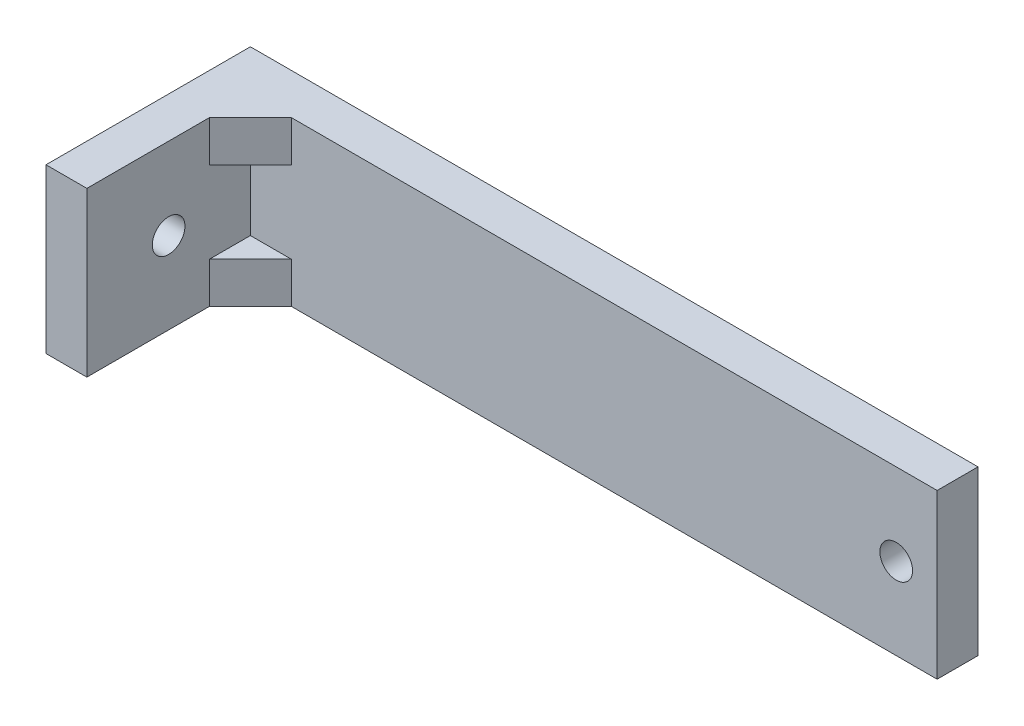
ISO-10303-21;
HEADER;
FILE_DESCRIPTION(('STEP AP214'),'2;1');
FILE_NAME('part.step','',(''),(''),'','','');
FILE_SCHEMA(('AUTOMOTIVE_DESIGN { 1 0 10303 214 1 1 1 1 }'));
ENDSEC;
DATA;
#1=APPLICATION_CONTEXT('core data for automotive mechanical design processes');
#2=APPLICATION_PROTOCOL_DEFINITION('international standard','automotive_design',2000,#1);
#3=PRODUCT_CONTEXT('',#1,'mechanical');
#4=PRODUCT('Part','Part','',(#3));
#5=PRODUCT_RELATED_PRODUCT_CATEGORY('part','',(#4));
#6=PRODUCT_DEFINITION_FORMATION('','',#4);
#7=PRODUCT_DEFINITION_CONTEXT('part definition',#1,'design');
#8=PRODUCT_DEFINITION('design','',#6,#7);
#9=PRODUCT_DEFINITION_SHAPE('','',#8);
#10=(LENGTH_UNIT() NAMED_UNIT(*) SI_UNIT(.MILLI.,.METRE.));
#11=(NAMED_UNIT(*) PLANE_ANGLE_UNIT() SI_UNIT($,.RADIAN.));
#12=(NAMED_UNIT(*) SI_UNIT($,.STERADIAN.) SOLID_ANGLE_UNIT());
#13=UNCERTAINTY_MEASURE_WITH_UNIT(LENGTH_MEASURE(1.E-05),#10,'distance_accuracy_value','');
#14=(GEOMETRIC_REPRESENTATION_CONTEXT(3) GLOBAL_UNCERTAINTY_ASSIGNED_CONTEXT((#13)) GLOBAL_UNIT_ASSIGNED_CONTEXT((#10,
#11,#12)) REPRESENTATION_CONTEXT('',''));
#15=CARTESIAN_POINT('',(0.,0.,0.));
#16=DIRECTION('',(0.,0.,1.));
#17=DIRECTION('',(1.,0.,0.));
#18=AXIS2_PLACEMENT_3D('',#15,#16,#17);
#19=CARTESIAN_POINT('',(0.,0.,5.));
#20=DIRECTION('',(0.,0.,1.));
#21=DIRECTION('',(1.,0.,0.));
#22=AXIS2_PLACEMENT_3D('',#19,#20,#21);
#23=PLANE('',#22);
#24=DIRECTION('',(-1.,0.,0.));
#25=VECTOR('',#24,1.);
#26=CARTESIAN_POINT('',(-34.5,-5.,5.));
#27=LINE('',#26,#25);
#28=CARTESIAN_POINT('',(-34.5,-5.,5.));
#29=VERTEX_POINT('',#28);
#30=CARTESIAN_POINT('',(-39.5,-5.,5.));
#31=VERTEX_POINT('',#30);
#32=EDGE_CURVE('E184',#29,#31,#27,.T.);
#33=ORIENTED_EDGE('',*,*,#32,.F.);
#34=DIRECTION('',(0.,1.,0.));
#35=VECTOR('',#34,1.);
#36=CARTESIAN_POINT('',(-34.5,-10.,5.));
#37=LINE('',#36,#35);
#38=CARTESIAN_POINT('',(-34.5,-10.,5.));
#39=VERTEX_POINT('',#38);
#40=EDGE_CURVE('E115',#39,#29,#37,.T.);
#41=ORIENTED_EDGE('',*,*,#40,.F.);
#42=DIRECTION('',(1.,0.,0.));
#43=VECTOR('',#42,1.);
#44=CARTESIAN_POINT('',(-44.5,-10.,5.));
#45=LINE('',#44,#43);
#46=CARTESIAN_POINT('',(44.5,-10.,5.));
#47=VERTEX_POINT('',#46);
#48=EDGE_CURVE('E125',#39,#47,#45,.T.);
#49=ORIENTED_EDGE('',*,*,#48,.T.);
#50=DIRECTION('',(0.,1.,0.));
#51=VECTOR('',#50,1.);
#52=CARTESIAN_POINT('',(44.5,10.,5.));
#53=LINE('',#52,#51);
#54=CARTESIAN_POINT('',(44.5,10.,5.));
#55=VERTEX_POINT('',#54);
#56=EDGE_CURVE('E145',#47,#55,#53,.T.);
#57=ORIENTED_EDGE('',*,*,#56,.T.);
#58=DIRECTION('',(-1.,0.,0.));
#59=VECTOR('',#58,1.);
#60=CARTESIAN_POINT('',(-44.5,10.,5.));
#61=LINE('',#60,#59);
#62=CARTESIAN_POINT('',(-34.5,10.,5.));
#63=VERTEX_POINT('',#62);
#64=EDGE_CURVE('E148',#55,#63,#61,.T.);
#65=ORIENTED_EDGE('',*,*,#64,.T.);
#66=DIRECTION('',(0.,1.,0.));
#67=VECTOR('',#66,1.);
#68=CARTESIAN_POINT('',(-34.5,10.,5.));
#69=LINE('',#68,#67);
#70=CARTESIAN_POINT('',(-34.5,5.,5.));
#71=VERTEX_POINT('',#70);
#72=EDGE_CURVE('E222',#71,#63,#69,.T.);
#73=ORIENTED_EDGE('',*,*,#72,.F.);
#74=DIRECTION('',(-1.,0.,0.));
#75=VECTOR('',#74,1.);
#76=CARTESIAN_POINT('',(-34.5,5.,5.));
#77=LINE('',#76,#75);
#78=CARTESIAN_POINT('',(-39.5,5.,5.));
#79=VERTEX_POINT('',#78);
#80=EDGE_CURVE('E190',#71,#79,#77,.T.);
#81=ORIENTED_EDGE('',*,*,#80,.T.);
#82=DIRECTION('',(0.,1.,0.));
#83=VECTOR('',#82,1.);
#84=CARTESIAN_POINT('',(-39.5,10.,5.));
#85=LINE('',#84,#83);
#86=EDGE_CURVE('E202',#31,#79,#85,.T.);
#87=ORIENTED_EDGE('',*,*,#86,.F.);
#88=EDGE_LOOP('',(#33,#41,#49,#57,#65,#73,#81,#87));
#89=FACE_BOUND('',#88,.T.);
#90=CARTESIAN_POINT('',(39.5,0.,5.));
#91=DIRECTION('',(0.,0.,1.));
#92=DIRECTION('',(1.,0.,0.));
#93=AXIS2_PLACEMENT_3D('',#90,#91,#92);
#94=CIRCLE('',#93,2.);
#95=CARTESIAN_POINT('',(41.5,0.,5.));
#96=VERTEX_POINT('',#95);
#97=EDGE_CURVE('E195',#96,#96,#94,.T.);
#98=ORIENTED_EDGE('',*,*,#97,.F.);
#99=EDGE_LOOP('',(#98));
#100=FACE_BOUND('',#99,.T.);
#101=ADVANCED_FACE('F34',(#89,#100),#23,.T.);
#102=CARTESIAN_POINT('',(-39.5,10.,25.));
#103=DIRECTION('',(-1.,0.,0.));
#104=DIRECTION('',(0.,0.,1.));
#105=AXIS2_PLACEMENT_3D('',#102,#103,#104);
#106=PLANE('',#105);
#107=DIRECTION('',(0.,0.,-1.));
#108=VECTOR('',#107,1.);
#109=CARTESIAN_POINT('',(-39.5,5.,5.));
#110=LINE('',#109,#108);
#111=CARTESIAN_POINT('',(-39.5,5.,10.));
#112=VERTEX_POINT('',#111);
#113=EDGE_CURVE('E210',#112,#79,#110,.T.);
#114=ORIENTED_EDGE('',*,*,#113,.F.);
#115=DIRECTION('',(0.,-1.,0.));
#116=VECTOR('',#115,1.);
#117=CARTESIAN_POINT('',(-39.5,10.,10.));
#118=LINE('',#117,#116);
#119=CARTESIAN_POINT('',(-39.5,10.,10.));
#120=VERTEX_POINT('',#119);
#121=EDGE_CURVE('E215',#120,#112,#118,.T.);
#122=ORIENTED_EDGE('',*,*,#121,.F.);
#123=DIRECTION('',(0.,0.,-1.));
#124=VECTOR('',#123,1.);
#125=CARTESIAN_POINT('',(-39.5,10.,25.));
#126=LINE('',#125,#124);
#127=CARTESIAN_POINT('',(-39.5,10.,25.));
#128=VERTEX_POINT('',#127);
#129=EDGE_CURVE('E135',#128,#120,#126,.T.);
#130=ORIENTED_EDGE('',*,*,#129,.F.);
#131=DIRECTION('',(0.,1.,0.));
#132=VECTOR('',#131,1.);
#133=CARTESIAN_POINT('',(-39.5,10.,25.));
#134=LINE('',#133,#132);
#135=CARTESIAN_POINT('',(-39.5,-10.,25.));
#136=VERTEX_POINT('',#135);
#137=EDGE_CURVE('E133',#136,#128,#134,.T.);
#138=ORIENTED_EDGE('',*,*,#137,.F.);
#139=DIRECTION('',(0.,0.,-1.));
#140=VECTOR('',#139,1.);
#141=CARTESIAN_POINT('',(-39.5,-10.,25.));
#142=LINE('',#141,#140);
#143=CARTESIAN_POINT('',(-39.5,-10.,10.));
#144=VERTEX_POINT('',#143);
#145=EDGE_CURVE('E122',#136,#144,#142,.T.);
#146=ORIENTED_EDGE('',*,*,#145,.T.);
#147=DIRECTION('',(0.,-1.,0.));
#148=VECTOR('',#147,1.);
#149=CARTESIAN_POINT('',(-39.5,-10.,10.));
#150=LINE('',#149,#148);
#151=CARTESIAN_POINT('',(-39.5,-5.,10.));
#152=VERTEX_POINT('',#151);
#153=EDGE_CURVE('E110',#152,#144,#150,.T.);
#154=ORIENTED_EDGE('',*,*,#153,.F.);
#155=DIRECTION('',(0.,0.,1.));
#156=VECTOR('',#155,1.);
#157=CARTESIAN_POINT('',(-39.5,-5.,5.));
#158=LINE('',#157,#156);
#159=EDGE_CURVE('E57',#31,#152,#158,.T.);
#160=ORIENTED_EDGE('',*,*,#159,.F.);
#161=ORIENTED_EDGE('',*,*,#86,.T.);
#162=EDGE_LOOP('',(#114,#122,#130,#138,#146,#154,#160,#161));
#163=FACE_BOUND('',#162,.T.);
#164=CARTESIAN_POINT('',(-39.5,0.,15.));
#165=DIRECTION('',(1.,0.,0.));
#166=DIRECTION('',(0.,0.,-1.));
#167=AXIS2_PLACEMENT_3D('',#164,#165,#166);
#168=CIRCLE('',#167,2.);
#169=CARTESIAN_POINT('',(-39.5,0.,13.));
#170=VERTEX_POINT('',#169);
#171=EDGE_CURVE('E198',#170,#170,#168,.T.);
#172=ORIENTED_EDGE('',*,*,#171,.F.);
#173=EDGE_LOOP('',(#172));
#174=FACE_BOUND('',#173,.T.);
#175=ADVANCED_FACE('F130',(#163,#174),#106,.F.);
#176=CARTESIAN_POINT('',(44.5,10.,5.));
#177=DIRECTION('',(-1.,0.,0.));
#178=DIRECTION('',(0.,0.,1.));
#179=AXIS2_PLACEMENT_3D('',#176,#177,#178);
#180=PLANE('',#179);
#181=DIRECTION('',(0.,1.,0.));
#182=VECTOR('',#181,1.);
#183=CARTESIAN_POINT('',(44.5,10.,0.));
#184=LINE('',#183,#182);
#185=CARTESIAN_POINT('',(44.5,-10.,0.));
#186=VERTEX_POINT('',#185);
#187=CARTESIAN_POINT('',(44.5,10.,0.));
#188=VERTEX_POINT('',#187);
#189=EDGE_CURVE('E134',#186,#188,#184,.T.);
#190=ORIENTED_EDGE('',*,*,#189,.T.);
#191=DIRECTION('',(0.,0.,-1.));
#192=VECTOR('',#191,1.);
#193=CARTESIAN_POINT('',(44.5,10.,5.));
#194=LINE('',#193,#192);
#195=EDGE_CURVE('E11',#55,#188,#194,.T.);
#196=ORIENTED_EDGE('',*,*,#195,.F.);
#197=ORIENTED_EDGE('',*,*,#56,.F.);
#198=DIRECTION('',(0.,0.,-1.));
#199=VECTOR('',#198,1.);
#200=CARTESIAN_POINT('',(44.5,-10.,5.));
#201=LINE('',#200,#199);
#202=EDGE_CURVE('E152',#47,#186,#201,.T.);
#203=ORIENTED_EDGE('',*,*,#202,.T.);
#204=EDGE_LOOP('',(#190,#196,#197,#203));
#205=FACE_BOUND('',#204,.T.);
#206=ADVANCED_FACE('F36',(#205),#180,.F.);
#207=CARTESIAN_POINT('',(-44.5,10.,5.));
#208=DIRECTION('',(0.,-1.,0.));
#209=DIRECTION('',(0.,0.,-1.));
#210=AXIS2_PLACEMENT_3D('',#207,#208,#209);
#211=PLANE('',#210);
#212=ORIENTED_EDGE('',*,*,#129,.T.);
#213=DIRECTION('',(-0.707106781186547,0.,0.707106781186548));
#214=VECTOR('',#213,1.);
#215=CARTESIAN_POINT('',(-34.5,10.,5.));
#216=LINE('',#215,#214);
#217=EDGE_CURVE('E127',#63,#120,#216,.T.);
#218=ORIENTED_EDGE('',*,*,#217,.F.);
#219=ORIENTED_EDGE('',*,*,#64,.F.);
#220=ORIENTED_EDGE('',*,*,#195,.T.);
#221=DIRECTION('',(-1.,0.,0.));
#222=VECTOR('',#221,1.);
#223=CARTESIAN_POINT('',(-44.5,10.,0.));
#224=LINE('',#223,#222);
#225=CARTESIAN_POINT('',(-44.5,10.,0.));
#226=VERTEX_POINT('',#225);
#227=EDGE_CURVE('E138',#188,#226,#224,.T.);
#228=ORIENTED_EDGE('',*,*,#227,.T.);
#229=DIRECTION('',(0.,0.,-1.));
#230=VECTOR('',#229,1.);
#231=CARTESIAN_POINT('',(-44.5,10.,5.));
#232=LINE('',#231,#230);
#233=CARTESIAN_POINT('',(-44.5,10.,25.));
#234=VERTEX_POINT('',#233);
#235=EDGE_CURVE('E42',#234,#226,#232,.T.);
#236=ORIENTED_EDGE('',*,*,#235,.F.);
#237=DIRECTION('',(-1.,0.,0.));
#238=VECTOR('',#237,1.);
#239=CARTESIAN_POINT('',(-44.5,10.,25.));
#240=LINE('',#239,#238);
#241=EDGE_CURVE('E141',#128,#234,#240,.T.);
#242=ORIENTED_EDGE('',*,*,#241,.F.);
#243=EDGE_LOOP('',(#212,#218,#219,#220,#228,#236,#242));
#244=FACE_BOUND('',#243,.T.);
#245=ADVANCED_FACE('F228',(#244),#211,.F.);
#246=CARTESIAN_POINT('',(-44.5,10.,5.));
#247=DIRECTION('',(1.,0.,0.));
#248=DIRECTION('',(0.,0.,-1.));
#249=AXIS2_PLACEMENT_3D('',#246,#247,#248);
#250=PLANE('',#249);
#251=CARTESIAN_POINT('',(-44.5,0.,15.));
#252=DIRECTION('',(1.,0.,0.));
#253=DIRECTION('',(0.,0.,-1.));
#254=AXIS2_PLACEMENT_3D('',#251,#252,#253);
#255=CIRCLE('',#254,2.);
#256=CARTESIAN_POINT('',(-44.5,0.,13.));
#257=VERTEX_POINT('',#256);
#258=EDGE_CURVE('E199',#257,#257,#255,.T.);
#259=ORIENTED_EDGE('',*,*,#258,.T.);
#260=EDGE_LOOP('',(#259));
#261=FACE_BOUND('',#260,.T.);
#262=DIRECTION('',(0.,-1.,0.));
#263=VECTOR('',#262,1.);
#264=CARTESIAN_POINT('',(-44.5,10.,0.));
#265=LINE('',#264,#263);
#266=CARTESIAN_POINT('',(-44.5,-10.,0.));
#267=VERTEX_POINT('',#266);
#268=EDGE_CURVE('E155',#226,#267,#265,.T.);
#269=ORIENTED_EDGE('',*,*,#268,.T.);
#270=DIRECTION('',(0.,0.,-1.));
#271=VECTOR('',#270,1.);
#272=CARTESIAN_POINT('',(-44.5,-10.,5.));
#273=LINE('',#272,#271);
#274=CARTESIAN_POINT('',(-44.5,-10.,25.));
#275=VERTEX_POINT('',#274);
#276=EDGE_CURVE('E160',#275,#267,#273,.T.);
#277=ORIENTED_EDGE('',*,*,#276,.F.);
#278=DIRECTION('',(0.,-1.,0.));
#279=VECTOR('',#278,1.);
#280=CARTESIAN_POINT('',(-44.5,10.,25.));
#281=LINE('',#280,#279);
#282=EDGE_CURVE('E168',#234,#275,#281,.T.);
#283=ORIENTED_EDGE('',*,*,#282,.F.);
#284=ORIENTED_EDGE('',*,*,#235,.T.);
#285=EDGE_LOOP('',(#269,#277,#283,#284));
#286=FACE_BOUND('',#285,.T.);
#287=ADVANCED_FACE('F166',(#261,#286),#250,.F.);
#288=CARTESIAN_POINT('',(-44.5,-10.,5.));
#289=DIRECTION('',(0.,1.,0.));
#290=DIRECTION('',(0.,0.,1.));
#291=AXIS2_PLACEMENT_3D('',#288,#289,#290);
#292=PLANE('',#291);
#293=ORIENTED_EDGE('',*,*,#48,.F.);
#294=DIRECTION('',(-0.707106781186547,0.,0.707106781186548));
#295=VECTOR('',#294,1.);
#296=CARTESIAN_POINT('',(-34.5,-10.,5.));
#297=LINE('',#296,#295);
#298=EDGE_CURVE('E49',#39,#144,#297,.T.);
#299=ORIENTED_EDGE('',*,*,#298,.T.);
#300=ORIENTED_EDGE('',*,*,#145,.F.);
#301=DIRECTION('',(1.,0.,0.));
#302=VECTOR('',#301,1.);
#303=CARTESIAN_POINT('',(-44.5,-10.,25.));
#304=LINE('',#303,#302);
#305=EDGE_CURVE('E206',#275,#136,#304,.T.);
#306=ORIENTED_EDGE('',*,*,#305,.F.);
#307=ORIENTED_EDGE('',*,*,#276,.T.);
#308=DIRECTION('',(1.,0.,0.));
#309=VECTOR('',#308,1.);
#310=CARTESIAN_POINT('',(-44.5,-10.,0.));
#311=LINE('',#310,#309);
#312=EDGE_CURVE('E149',#267,#186,#311,.T.);
#313=ORIENTED_EDGE('',*,*,#312,.T.);
#314=ORIENTED_EDGE('',*,*,#202,.F.);
#315=EDGE_LOOP('',(#293,#299,#300,#306,#307,#313,#314));
#316=FACE_BOUND('',#315,.T.);
#317=ADVANCED_FACE('F120',(#316),#292,.F.);
#318=CARTESIAN_POINT('',(0.,0.,0.));
#319=DIRECTION('',(0.,0.,1.));
#320=DIRECTION('',(1.,0.,0.));
#321=AXIS2_PLACEMENT_3D('',#318,#319,#320);
#322=PLANE('',#321);
#323=CARTESIAN_POINT('',(39.5,0.,0.));
#324=DIRECTION('',(0.,0.,-1.));
#325=DIRECTION('',(-1.,0.,0.));
#326=AXIS2_PLACEMENT_3D('',#323,#324,#325);
#327=CIRCLE('',#326,2.);
#328=CARTESIAN_POINT('',(37.5,0.,0.));
#329=VERTEX_POINT('',#328);
#330=EDGE_CURVE('E186',#329,#329,#327,.T.);
#331=ORIENTED_EDGE('',*,*,#330,.F.);
#332=EDGE_LOOP('',(#331));
#333=FACE_BOUND('',#332,.T.);
#334=ORIENTED_EDGE('',*,*,#189,.F.);
#335=ORIENTED_EDGE('',*,*,#312,.F.);
#336=ORIENTED_EDGE('',*,*,#268,.F.);
#337=ORIENTED_EDGE('',*,*,#227,.F.);
#338=EDGE_LOOP('',(#334,#335,#336,#337));
#339=FACE_BOUND('',#338,.T.);
#340=ADVANCED_FACE('F175',(#333,#339),#322,.F.);
#341=CARTESIAN_POINT('',(0.,0.,25.));
#342=DIRECTION('',(0.,0.,1.));
#343=DIRECTION('',(1.,0.,0.));
#344=AXIS2_PLACEMENT_3D('',#341,#342,#343);
#345=PLANE('',#344);
#346=ORIENTED_EDGE('',*,*,#282,.T.);
#347=ORIENTED_EDGE('',*,*,#305,.T.);
#348=ORIENTED_EDGE('',*,*,#137,.T.);
#349=ORIENTED_EDGE('',*,*,#241,.T.);
#350=EDGE_LOOP('',(#346,#347,#348,#349));
#351=FACE_BOUND('',#350,.T.);
#352=ADVANCED_FACE('F230',(#351),#345,.T.);
#353=CARTESIAN_POINT('',(-44.5,0.,15.));
#354=DIRECTION('',(1.,0.,0.));
#355=DIRECTION('',(0.,0.,-1.));
#356=AXIS2_PLACEMENT_3D('',#353,#354,#355);
#357=CYLINDRICAL_SURFACE('',#356,2.);
#358=ORIENTED_EDGE('',*,*,#258,.F.);
#359=EDGE_LOOP('',(#358));
#360=FACE_BOUND('',#359,.T.);
#361=ORIENTED_EDGE('',*,*,#171,.T.);
#362=EDGE_LOOP('',(#361));
#363=FACE_BOUND('',#362,.T.);
#364=ADVANCED_FACE('F232',(#360,#363),#357,.F.);
#365=CARTESIAN_POINT('',(39.5,0.,20.));
#366=DIRECTION('',(0.,0.,-1.));
#367=DIRECTION('',(-1.,0.,0.));
#368=AXIS2_PLACEMENT_3D('',#365,#366,#367);
#369=CYLINDRICAL_SURFACE('',#368,2.);
#370=ORIENTED_EDGE('',*,*,#97,.T.);
#371=EDGE_LOOP('',(#370));
#372=FACE_BOUND('',#371,.T.);
#373=ORIENTED_EDGE('',*,*,#330,.T.);
#374=EDGE_LOOP('',(#373));
#375=FACE_BOUND('',#374,.T.);
#376=ADVANCED_FACE('F238',(#372,#375),#369,.F.);
#377=CARTESIAN_POINT('',(-34.5,-5.,5.));
#378=DIRECTION('',(0.,-1.,0.));
#379=DIRECTION('',(0.,0.,-1.));
#380=AXIS2_PLACEMENT_3D('',#377,#378,#379);
#381=PLANE('',#380);
#382=ORIENTED_EDGE('',*,*,#159,.T.);
#383=DIRECTION('',(0.707106781186547,0.,-0.707106781186548));
#384=VECTOR('',#383,1.);
#385=CARTESIAN_POINT('',(-34.5,-5.,5.));
#386=LINE('',#385,#384);
#387=EDGE_CURVE('E113',#152,#29,#386,.T.);
#388=ORIENTED_EDGE('',*,*,#387,.T.);
#389=ORIENTED_EDGE('',*,*,#32,.T.);
#390=EDGE_LOOP('',(#382,#388,#389));
#391=FACE_BOUND('',#390,.T.);
#392=ADVANCED_FACE('F214',(#391),#381,.F.);
#393=CARTESIAN_POINT('',(-34.5,5.,5.));
#394=DIRECTION('',(0.,1.,0.));
#395=DIRECTION('',(0.,0.,1.));
#396=AXIS2_PLACEMENT_3D('',#393,#394,#395);
#397=PLANE('',#396);
#398=ORIENTED_EDGE('',*,*,#80,.F.);
#399=DIRECTION('',(-0.707106781186547,0.,0.707106781186548));
#400=VECTOR('',#399,1.);
#401=CARTESIAN_POINT('',(-34.5,5.,5.));
#402=LINE('',#401,#400);
#403=EDGE_CURVE('E126',#71,#112,#402,.T.);
#404=ORIENTED_EDGE('',*,*,#403,.T.);
#405=ORIENTED_EDGE('',*,*,#113,.T.);
#406=EDGE_LOOP('',(#398,#404,#405));
#407=FACE_BOUND('',#406,.T.);
#408=ADVANCED_FACE('F224',(#407),#397,.F.);
#409=CARTESIAN_POINT('',(-34.5,-10.,5.));
#410=DIRECTION('',(-0.707106781186548,0.,-0.707106781186547));
#411=DIRECTION('',(-0.707106781186547,0.,0.707106781186548));
#412=AXIS2_PLACEMENT_3D('',#409,#410,#411);
#413=PLANE('',#412);
#414=ORIENTED_EDGE('',*,*,#72,.T.);
#415=ORIENTED_EDGE('',*,*,#217,.T.);
#416=ORIENTED_EDGE('',*,*,#121,.T.);
#417=ORIENTED_EDGE('',*,*,#403,.F.);
#418=EDGE_LOOP('',(#414,#415,#416,#417));
#419=FACE_BOUND('',#418,.T.);
#420=ADVANCED_FACE('F226',(#419),#413,.F.);
#421=ORIENTED_EDGE('',*,*,#153,.T.);
#422=ORIENTED_EDGE('',*,*,#298,.F.);
#423=ORIENTED_EDGE('',*,*,#40,.T.);
#424=ORIENTED_EDGE('',*,*,#387,.F.);
#425=EDGE_LOOP('',(#421,#422,#423,#424));
#426=FACE_BOUND('',#425,.T.);
#427=ADVANCED_FACE('F111',(#426),#413,.F.);
#428=CLOSED_SHELL('',(#101,#175,#206,#245,#287,#317,#340,#352,#364,#376,#392,#408,#420,#427));
#429=MANIFOLD_SOLID_BREP('B2',#428);
#430=ADVANCED_BREP_SHAPE_REPRESENTATION('',(#18,#429),#14);
#431=SHAPE_DEFINITION_REPRESENTATION(#9,#430);
ENDSEC;
END-ISO-10303-21;
